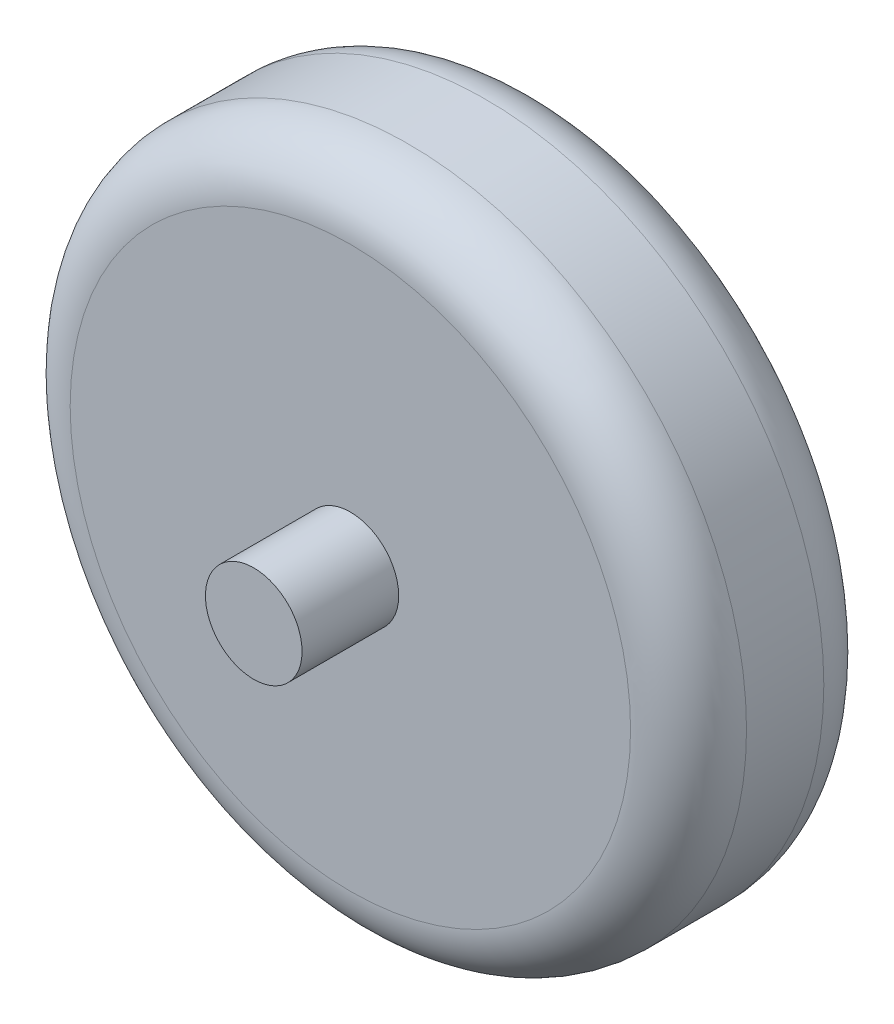
ISO-10303-21;
HEADER;
FILE_DESCRIPTION(('STEP AP214'),'2;1');
FILE_NAME('part.step','',(''),(''),'','','');
FILE_SCHEMA(('AUTOMOTIVE_DESIGN { 1 0 10303 214 1 1 1 1 }'));
ENDSEC;
DATA;
#1=APPLICATION_CONTEXT('core data for automotive mechanical design processes');
#2=APPLICATION_PROTOCOL_DEFINITION('international standard','automotive_design',2000,#1);
#3=PRODUCT_CONTEXT('',#1,'mechanical');
#4=PRODUCT('Part','Part','',(#3));
#5=PRODUCT_RELATED_PRODUCT_CATEGORY('part','',(#4));
#6=PRODUCT_DEFINITION_FORMATION('','',#4);
#7=PRODUCT_DEFINITION_CONTEXT('part definition',#1,'design');
#8=PRODUCT_DEFINITION('design','',#6,#7);
#9=PRODUCT_DEFINITION_SHAPE('','',#8);
#10=(LENGTH_UNIT() NAMED_UNIT(*) SI_UNIT(.MILLI.,.METRE.));
#11=(NAMED_UNIT(*) PLANE_ANGLE_UNIT() SI_UNIT($,.RADIAN.));
#12=(NAMED_UNIT(*) SI_UNIT($,.STERADIAN.) SOLID_ANGLE_UNIT());
#13=UNCERTAINTY_MEASURE_WITH_UNIT(LENGTH_MEASURE(1.E-05),#10,'distance_accuracy_value','');
#14=(GEOMETRIC_REPRESENTATION_CONTEXT(3) GLOBAL_UNCERTAINTY_ASSIGNED_CONTEXT((#13)) GLOBAL_UNIT_ASSIGNED_CONTEXT((#10,
#11,#12)) REPRESENTATION_CONTEXT('',''));
#15=CARTESIAN_POINT('',(0.,0.,0.));
#16=DIRECTION('',(0.,0.,1.));
#17=DIRECTION('',(1.,0.,0.));
#18=AXIS2_PLACEMENT_3D('',#15,#16,#17);
#19=CARTESIAN_POINT('',(0.,0.,5.));
#20=DIRECTION('',(0.,0.,-1.));
#21=DIRECTION('',(-1.,0.,0.));
#22=AXIS2_PLACEMENT_3D('',#19,#20,#21);
#23=CYLINDRICAL_SURFACE('',#22,17.5);
#24=CARTESIAN_POINT('',(0.,0.,-2.));
#25=DIRECTION('',(0.,0.,1.));
#26=DIRECTION('',(1.,0.,0.));
#27=AXIS2_PLACEMENT_3D('',#24,#25,#26);
#28=CIRCLE('',#27,17.5);
#29=CARTESIAN_POINT('',(17.5,0.,-2.));
#30=VERTEX_POINT('',#29);
#31=EDGE_CURVE('E55',#30,#30,#28,.T.);
#32=ORIENTED_EDGE('',*,*,#31,.T.);
#33=EDGE_LOOP('',(#32));
#34=FACE_BOUND('',#33,.T.);
#35=CARTESIAN_POINT('',(0.,0.,2.));
#36=DIRECTION('',(0.,0.,1.));
#37=DIRECTION('',(1.,0.,0.));
#38=AXIS2_PLACEMENT_3D('',#35,#36,#37);
#39=CIRCLE('',#38,17.5);
#40=CARTESIAN_POINT('',(17.5,0.,2.));
#41=VERTEX_POINT('',#40);
#42=EDGE_CURVE('E61',#41,#41,#39,.F.);
#43=ORIENTED_EDGE('',*,*,#42,.T.);
#44=EDGE_LOOP('',(#43));
#45=FACE_BOUND('',#44,.T.);
#46=ADVANCED_FACE('F37',(#34,#45),#23,.T.);
#47=CARTESIAN_POINT('',(0.,0.,5.));
#48=DIRECTION('',(0.,0.,1.));
#49=DIRECTION('',(1.,0.,0.));
#50=AXIS2_PLACEMENT_3D('',#47,#48,#49);
#51=PLANE('',#50);
#52=CARTESIAN_POINT('',(0.,0.,5.));
#53=DIRECTION('',(0.,0.,1.));
#54=DIRECTION('',(1.,0.,0.));
#55=AXIS2_PLACEMENT_3D('',#52,#53,#54);
#56=CIRCLE('',#55,2.5);
#57=CARTESIAN_POINT('',(2.5,0.,5.));
#58=VERTEX_POINT('',#57);
#59=EDGE_CURVE('E65',#58,#58,#56,.F.);
#60=ORIENTED_EDGE('',*,*,#59,.T.);
#61=EDGE_LOOP('',(#60));
#62=FACE_BOUND('',#61,.T.);
#63=CARTESIAN_POINT('',(0.,0.,5.));
#64=DIRECTION('',(0.,0.,1.));
#65=DIRECTION('',(1.,0.,0.));
#66=AXIS2_PLACEMENT_3D('',#63,#64,#65);
#67=CIRCLE('',#66,14.5);
#68=CARTESIAN_POINT('',(14.5,0.,5.));
#69=VERTEX_POINT('',#68);
#70=EDGE_CURVE('E45',#69,#69,#67,.T.);
#71=ORIENTED_EDGE('',*,*,#70,.T.);
#72=EDGE_LOOP('',(#71));
#73=FACE_BOUND('',#72,.T.);
#74=ADVANCED_FACE('F96',(#62,#73),#51,.T.);
#75=CARTESIAN_POINT('',(0.,0.,-5.));
#76=DIRECTION('',(0.,0.,1.));
#77=DIRECTION('',(1.,0.,0.));
#78=AXIS2_PLACEMENT_3D('',#75,#76,#77);
#79=PLANE('',#78);
#80=CARTESIAN_POINT('',(0.,0.,-5.));
#81=DIRECTION('',(0.,0.,1.));
#82=DIRECTION('',(1.,0.,0.));
#83=AXIS2_PLACEMENT_3D('',#80,#81,#82);
#84=CIRCLE('',#83,2.5);
#85=CARTESIAN_POINT('',(2.5,0.,-5.));
#86=VERTEX_POINT('',#85);
#87=EDGE_CURVE('E10',#86,#86,#84,.F.);
#88=ORIENTED_EDGE('',*,*,#87,.F.);
#89=EDGE_LOOP('',(#88));
#90=FACE_BOUND('',#89,.T.);
#91=CARTESIAN_POINT('',(0.,0.,-5.));
#92=DIRECTION('',(0.,0.,1.));
#93=DIRECTION('',(1.,0.,0.));
#94=AXIS2_PLACEMENT_3D('',#91,#92,#93);
#95=CIRCLE('',#94,14.5);
#96=CARTESIAN_POINT('',(14.5,0.,-5.));
#97=VERTEX_POINT('',#96);
#98=EDGE_CURVE('E50',#97,#97,#95,.F.);
#99=ORIENTED_EDGE('',*,*,#98,.T.);
#100=EDGE_LOOP('',(#99));
#101=FACE_BOUND('',#100,.T.);
#102=ADVANCED_FACE('F102',(#90,#101),#79,.F.);
#103=CARTESIAN_POINT('',(0.,0.,-2.));
#104=DIRECTION('',(0.,0.,1.));
#105=DIRECTION('',(1.,0.,0.));
#106=AXIS2_PLACEMENT_3D('',#103,#104,#105);
#107=TOROIDAL_SURFACE('',#106,14.5,3.);
#108=ORIENTED_EDGE('',*,*,#98,.F.);
#109=EDGE_LOOP('',(#108));
#110=FACE_BOUND('',#109,.T.);
#111=ORIENTED_EDGE('',*,*,#31,.F.);
#112=EDGE_LOOP('',(#111));
#113=FACE_BOUND('',#112,.T.);
#114=ADVANCED_FACE('F106',(#110,#113),#107,.T.);
#115=CARTESIAN_POINT('',(0.,0.,2.));
#116=DIRECTION('',(0.,0.,1.));
#117=DIRECTION('',(1.,0.,0.));
#118=AXIS2_PLACEMENT_3D('',#115,#116,#117);
#119=TOROIDAL_SURFACE('',#118,14.5,3.);
#120=ORIENTED_EDGE('',*,*,#42,.F.);
#121=EDGE_LOOP('',(#120));
#122=FACE_BOUND('',#121,.T.);
#123=ORIENTED_EDGE('',*,*,#70,.F.);
#124=EDGE_LOOP('',(#123));
#125=FACE_BOUND('',#124,.T.);
#126=ADVANCED_FACE('F39',(#122,#125),#119,.T.);
#127=CARTESIAN_POINT('',(0.,0.,-10.));
#128=DIRECTION('',(0.,0.,1.));
#129=DIRECTION('',(1.,0.,0.));
#130=AXIS2_PLACEMENT_3D('',#127,#128,#129);
#131=PLANE('',#130);
#132=CARTESIAN_POINT('',(0.,0.,-10.));
#133=DIRECTION('',(0.,0.,1.));
#134=DIRECTION('',(1.,0.,0.));
#135=AXIS2_PLACEMENT_3D('',#132,#133,#134);
#136=CIRCLE('',#135,2.5);
#137=CARTESIAN_POINT('',(2.5,0.,-10.));
#138=VERTEX_POINT('',#137);
#139=EDGE_CURVE('E70',#138,#138,#136,.T.);
#140=ORIENTED_EDGE('',*,*,#139,.F.);
#141=EDGE_LOOP('',(#140));
#142=FACE_BOUND('',#141,.T.);
#143=ADVANCED_FACE('F90',(#142),#131,.F.);
#144=CARTESIAN_POINT('',(0.,0.,10.));
#145=DIRECTION('',(0.,0.,-1.));
#146=DIRECTION('',(-1.,0.,0.));
#147=AXIS2_PLACEMENT_3D('',#144,#145,#146);
#148=CYLINDRICAL_SURFACE('',#147,2.5);
#149=ORIENTED_EDGE('',*,*,#139,.T.);
#150=EDGE_LOOP('',(#149));
#151=FACE_BOUND('',#150,.T.);
#152=ORIENTED_EDGE('',*,*,#87,.T.);
#153=EDGE_LOOP('',(#152));
#154=FACE_BOUND('',#153,.T.);
#155=ADVANCED_FACE('F82',(#151,#154),#148,.T.);
#156=ORIENTED_EDGE('',*,*,#59,.F.);
#157=EDGE_LOOP('',(#156));
#158=FACE_BOUND('',#157,.T.);
#159=CARTESIAN_POINT('',(0.,0.,10.));
#160=DIRECTION('',(0.,0.,1.));
#161=DIRECTION('',(1.,0.,0.));
#162=AXIS2_PLACEMENT_3D('',#159,#160,#161);
#163=CIRCLE('',#162,2.5);
#164=CARTESIAN_POINT('',(2.5,0.,10.));
#165=VERTEX_POINT('',#164);
#166=EDGE_CURVE('E69',#165,#165,#163,.T.);
#167=ORIENTED_EDGE('',*,*,#166,.F.);
#168=EDGE_LOOP('',(#167));
#169=FACE_BOUND('',#168,.T.);
#170=ADVANCED_FACE('F80',(#158,#169),#148,.T.);
#171=CARTESIAN_POINT('',(0.,0.,10.));
#172=DIRECTION('',(0.,0.,1.));
#173=DIRECTION('',(1.,0.,0.));
#174=AXIS2_PLACEMENT_3D('',#171,#172,#173);
#175=PLANE('',#174);
#176=ORIENTED_EDGE('',*,*,#166,.T.);
#177=EDGE_LOOP('',(#176));
#178=FACE_BOUND('',#177,.T.);
#179=ADVANCED_FACE('F78',(#178),#175,.T.);
#180=CLOSED_SHELL('',(#46,#74,#102,#114,#126,#143,#155,#170,#179));
#181=MANIFOLD_SOLID_BREP('B2',#180);
#182=ADVANCED_BREP_SHAPE_REPRESENTATION('',(#18,#181),#14);
#183=SHAPE_DEFINITION_REPRESENTATION(#9,#182);
ENDSEC;
END-ISO-10303-21;
